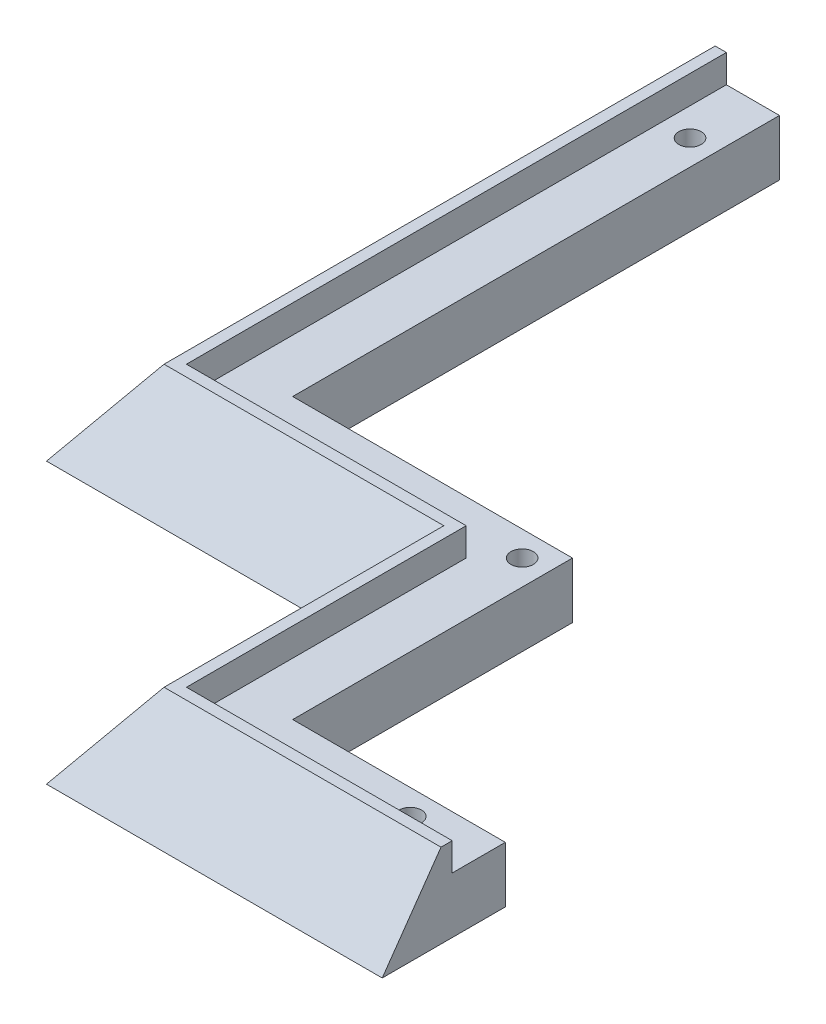
ISO-10303-21;
HEADER;
FILE_DESCRIPTION(('STEP AP214'),'2;1');
FILE_NAME('part.step','',(''),(''),'','','');
FILE_SCHEMA(('AUTOMOTIVE_DESIGN { 1 0 10303 214 1 1 1 1 }'));
ENDSEC;
DATA;
#1=APPLICATION_CONTEXT('core data for automotive mechanical design processes');
#2=APPLICATION_PROTOCOL_DEFINITION('international standard','automotive_design',2000,#1);
#3=PRODUCT_CONTEXT('',#1,'mechanical');
#4=PRODUCT('Part','Part','',(#3));
#5=PRODUCT_RELATED_PRODUCT_CATEGORY('part','',(#4));
#6=PRODUCT_DEFINITION_FORMATION('','',#4);
#7=PRODUCT_DEFINITION_CONTEXT('part definition',#1,'design');
#8=PRODUCT_DEFINITION('design','',#6,#7);
#9=PRODUCT_DEFINITION_SHAPE('','',#8);
#10=(LENGTH_UNIT() NAMED_UNIT(*) SI_UNIT(.MILLI.,.METRE.));
#11=(NAMED_UNIT(*) PLANE_ANGLE_UNIT() SI_UNIT($,.RADIAN.));
#12=(NAMED_UNIT(*) SI_UNIT($,.STERADIAN.) SOLID_ANGLE_UNIT());
#13=UNCERTAINTY_MEASURE_WITH_UNIT(LENGTH_MEASURE(1.E-05),#10,'distance_accuracy_value','');
#14=(GEOMETRIC_REPRESENTATION_CONTEXT(3) GLOBAL_UNCERTAINTY_ASSIGNED_CONTEXT((#13)) GLOBAL_UNIT_ASSIGNED_CONTEXT((#10,
#11,#12)) REPRESENTATION_CONTEXT('',''));
#15=CARTESIAN_POINT('',(0.,0.,0.));
#16=DIRECTION('',(0.,0.,1.));
#17=DIRECTION('',(1.,0.,0.));
#18=AXIS2_PLACEMENT_3D('',#15,#16,#17);
#19=CARTESIAN_POINT('',(68.6476510887299,15.,68.6476510887299));
#20=DIRECTION('',(-1.,0.,0.));
#21=DIRECTION('',(0.,0.,1.));
#22=AXIS2_PLACEMENT_3D('',#19,#20,#21);
#23=PLANE('',#22);
#24=DIRECTION('',(0.,0.,-1.));
#25=VECTOR('',#24,1.);
#26=CARTESIAN_POINT('',(68.6476510887299,10.,46.6476510887299));
#27=LINE('',#26,#25);
#28=CARTESIAN_POINT('',(68.6476510887299,10.,56.1403822311179));
#29=VERTEX_POINT('',#28);
#30=CARTESIAN_POINT('',(68.6476510887299,10.,46.6476510887299));
#31=VERTEX_POINT('',#30);
#32=EDGE_CURVE('E319',#29,#31,#27,.T.);
#33=ORIENTED_EDGE('',*,*,#32,.F.);
#34=DIRECTION('',(0.,1.,0.));
#35=VECTOR('',#34,1.);
#36=CARTESIAN_POINT('',(68.6476510887299,10.,56.1403822311179));
#37=LINE('',#36,#35);
#38=CARTESIAN_POINT('',(68.6476510887299,15.,56.1403822311179));
#39=VERTEX_POINT('',#38);
#40=EDGE_CURVE('E192',#29,#39,#37,.T.);
#41=ORIENTED_EDGE('',*,*,#40,.T.);
#42=DIRECTION('',(0.,0.,-1.));
#43=VECTOR('',#42,1.);
#44=CARTESIAN_POINT('',(68.6476510887299,15.,68.6476510887299));
#45=LINE('',#44,#43);
#46=CARTESIAN_POINT('',(68.6476510887299,15.,58.1445380155842));
#47=VERTEX_POINT('',#46);
#48=EDGE_CURVE('E193',#47,#39,#45,.T.);
#49=ORIENTED_EDGE('',*,*,#48,.F.);
#50=DIRECTION('',(0.,0.819152044288993,-0.573576436351045));
#51=VECTOR('',#50,1.);
#52=CARTESIAN_POINT('',(68.6476510887299,15.,58.1445380155842));
#53=LINE('',#52,#51);
#54=CARTESIAN_POINT('',(68.6476510887299,0.,68.6476510887299));
#55=VERTEX_POINT('',#54);
#56=EDGE_CURVE('E45',#47,#55,#53,.F.);
#57=ORIENTED_EDGE('',*,*,#56,.T.);
#58=DIRECTION('',(0.,0.,-1.));
#59=VECTOR('',#58,1.);
#60=CARTESIAN_POINT('',(68.6476510887299,0.,68.6476510887299));
#61=LINE('',#60,#59);
#62=CARTESIAN_POINT('',(68.6476510887299,0.,46.6476510887299));
#63=VERTEX_POINT('',#62);
#64=EDGE_CURVE('E211',#55,#63,#61,.T.);
#65=ORIENTED_EDGE('',*,*,#64,.T.);
#66=DIRECTION('',(0.,-1.,0.));
#67=VECTOR('',#66,1.);
#68=CARTESIAN_POINT('',(68.6476510887299,15.,46.6476510887299));
#69=LINE('',#68,#67);
#70=EDGE_CURVE('E235',#31,#63,#69,.T.);
#71=ORIENTED_EDGE('',*,*,#70,.F.);
#72=EDGE_LOOP('',(#33,#41,#49,#57,#65,#71));
#73=FACE_BOUND('',#72,.T.);
#74=ADVANCED_FACE('F35',(#73),#23,.F.);
#75=CARTESIAN_POINT('',(30.6476510887299,15.,46.6476510887299));
#76=DIRECTION('',(0.,0.,1.));
#77=DIRECTION('',(1.,0.,0.));
#78=AXIS2_PLACEMENT_3D('',#75,#76,#77);
#79=PLANE('',#78);
#80=DIRECTION('',(0.,-1.,0.));
#81=VECTOR('',#80,1.);
#82=CARTESIAN_POINT('',(30.6476510887299,15.,46.6476510887299));
#83=LINE('',#82,#81);
#84=CARTESIAN_POINT('',(30.6476510887299,10.,46.6476510887299));
#85=VERTEX_POINT('',#84);
#86=CARTESIAN_POINT('',(30.6476510887299,0.,46.6476510887299));
#87=VERTEX_POINT('',#86);
#88=EDGE_CURVE('E233',#85,#87,#83,.T.);
#89=ORIENTED_EDGE('',*,*,#88,.F.);
#90=DIRECTION('',(-1.,0.,0.));
#91=VECTOR('',#90,1.);
#92=CARTESIAN_POINT('',(30.6476510887299,10.,46.6476510887299));
#93=LINE('',#92,#91);
#94=EDGE_CURVE('E281',#31,#85,#93,.T.);
#95=ORIENTED_EDGE('',*,*,#94,.F.);
#96=ORIENTED_EDGE('',*,*,#70,.T.);
#97=DIRECTION('',(-1.,0.,0.));
#98=VECTOR('',#97,1.);
#99=CARTESIAN_POINT('',(30.6476510887299,0.,46.6476510887299));
#100=LINE('',#99,#98);
#101=EDGE_CURVE('E214',#63,#87,#100,.T.);
#102=ORIENTED_EDGE('',*,*,#101,.T.);
#103=EDGE_LOOP('',(#89,#95,#96,#102));
#104=FACE_BOUND('',#103,.T.);
#105=ADVANCED_FACE('F278',(#104),#79,.F.);
#106=CARTESIAN_POINT('',(30.6476510887299,15.,-3.3523489112701));
#107=DIRECTION('',(-1.,0.,0.));
#108=DIRECTION('',(0.,0.,1.));
#109=AXIS2_PLACEMENT_3D('',#106,#107,#108);
#110=PLANE('',#109);
#111=DIRECTION('',(0.,-1.,0.));
#112=VECTOR('',#111,1.);
#113=CARTESIAN_POINT('',(30.6476510887299,15.,-3.3523489112701));
#114=LINE('',#113,#112);
#115=CARTESIAN_POINT('',(30.6476510887299,10.,-3.3523489112701));
#116=VERTEX_POINT('',#115);
#117=CARTESIAN_POINT('',(30.6476510887299,0.,-3.3523489112701));
#118=VERTEX_POINT('',#117);
#119=EDGE_CURVE('E231',#116,#118,#114,.T.);
#120=ORIENTED_EDGE('',*,*,#119,.F.);
#121=DIRECTION('',(0.,0.,-1.));
#122=VECTOR('',#121,1.);
#123=CARTESIAN_POINT('',(30.6476510887299,10.,-3.3523489112701));
#124=LINE('',#123,#122);
#125=EDGE_CURVE('E316',#85,#116,#124,.T.);
#126=ORIENTED_EDGE('',*,*,#125,.F.);
#127=ORIENTED_EDGE('',*,*,#88,.T.);
#128=DIRECTION('',(0.,0.,-1.));
#129=VECTOR('',#128,1.);
#130=CARTESIAN_POINT('',(30.6476510887299,0.,-3.3523489112701));
#131=LINE('',#130,#129);
#132=EDGE_CURVE('E217',#87,#118,#131,.T.);
#133=ORIENTED_EDGE('',*,*,#132,.T.);
#134=EDGE_LOOP('',(#120,#126,#127,#133));
#135=FACE_BOUND('',#134,.T.);
#136=ADVANCED_FACE('F273',(#135),#110,.F.);
#137=CARTESIAN_POINT('',(-19.3523489112701,15.,-3.3523489112701));
#138=DIRECTION('',(0.,0.,1.));
#139=DIRECTION('',(1.,0.,0.));
#140=AXIS2_PLACEMENT_3D('',#137,#138,#139);
#141=PLANE('',#140);
#142=DIRECTION('',(0.,-1.,0.));
#143=VECTOR('',#142,1.);
#144=CARTESIAN_POINT('',(-19.3523489112701,15.,-3.3523489112701));
#145=LINE('',#144,#143);
#146=CARTESIAN_POINT('',(-19.3523489112701,10.,-3.3523489112701));
#147=VERTEX_POINT('',#146);
#148=CARTESIAN_POINT('',(-19.3523489112701,0.,-3.3523489112701));
#149=VERTEX_POINT('',#148);
#150=EDGE_CURVE('E229',#147,#149,#145,.T.);
#151=ORIENTED_EDGE('',*,*,#150,.F.);
#152=DIRECTION('',(-1.,0.,0.));
#153=VECTOR('',#152,1.);
#154=CARTESIAN_POINT('',(-19.3523489112701,10.,-3.3523489112701));
#155=LINE('',#154,#153);
#156=EDGE_CURVE('E169',#116,#147,#155,.T.);
#157=ORIENTED_EDGE('',*,*,#156,.F.);
#158=ORIENTED_EDGE('',*,*,#119,.T.);
#159=DIRECTION('',(-1.,0.,0.));
#160=VECTOR('',#159,1.);
#161=CARTESIAN_POINT('',(-19.3523489112701,0.,-3.3523489112701));
#162=LINE('',#161,#160);
#163=EDGE_CURVE('E220',#118,#149,#162,.T.);
#164=ORIENTED_EDGE('',*,*,#163,.T.);
#165=EDGE_LOOP('',(#151,#157,#158,#164));
#166=FACE_BOUND('',#165,.T.);
#167=ADVANCED_FACE('F268',(#166),#141,.F.);
#168=CARTESIAN_POINT('',(-19.3523489112701,15.,-90.3523489112701));
#169=DIRECTION('',(-1.,0.,0.));
#170=DIRECTION('',(0.,0.,1.));
#171=AXIS2_PLACEMENT_3D('',#168,#169,#170);
#172=PLANE('',#171);
#173=DIRECTION('',(0.,-1.,0.));
#174=VECTOR('',#173,1.);
#175=CARTESIAN_POINT('',(-19.3523489112701,15.,-90.3523489112701));
#176=LINE('',#175,#174);
#177=CARTESIAN_POINT('',(-19.3523489112701,10.,-90.3523489112701));
#178=VERTEX_POINT('',#177);
#179=CARTESIAN_POINT('',(-19.3523489112701,0.,-90.3523489112701));
#180=VERTEX_POINT('',#179);
#181=EDGE_CURVE('E198',#178,#180,#176,.T.);
#182=ORIENTED_EDGE('',*,*,#181,.F.);
#183=DIRECTION('',(0.,0.,-1.));
#184=VECTOR('',#183,1.);
#185=CARTESIAN_POINT('',(-19.3523489112701,10.,-90.3523489112701));
#186=LINE('',#185,#184);
#187=EDGE_CURVE('E158',#147,#178,#186,.T.);
#188=ORIENTED_EDGE('',*,*,#187,.F.);
#189=ORIENTED_EDGE('',*,*,#150,.T.);
#190=DIRECTION('',(0.,0.,-1.));
#191=VECTOR('',#190,1.);
#192=CARTESIAN_POINT('',(-19.3523489112701,0.,-90.3523489112701));
#193=LINE('',#192,#191);
#194=EDGE_CURVE('E223',#149,#180,#193,.T.);
#195=ORIENTED_EDGE('',*,*,#194,.T.);
#196=EDGE_LOOP('',(#182,#188,#189,#195));
#197=FACE_BOUND('',#196,.T.);
#198=ADVANCED_FACE('F263',(#197),#172,.F.);
#199=CARTESIAN_POINT('',(-41.3523489112701,15.,-90.3523489112701));
#200=DIRECTION('',(0.,0.,1.));
#201=DIRECTION('',(1.,0.,0.));
#202=AXIS2_PLACEMENT_3D('',#199,#200,#201);
#203=PLANE('',#202);
#204=DIRECTION('',(-1.,0.,0.));
#205=VECTOR('',#204,1.);
#206=CARTESIAN_POINT('',(-41.3523489112701,15.,-90.3523489112701));
#207=LINE('',#206,#205);
#208=CARTESIAN_POINT('',(-28.8492358381245,15.,-90.3523489112701));
#209=VERTEX_POINT('',#208);
#210=CARTESIAN_POINT('',(-30.8492358381244,15.,-90.3523489112701));
#211=VERTEX_POINT('',#210);
#212=EDGE_CURVE('E165',#209,#211,#207,.T.);
#213=ORIENTED_EDGE('',*,*,#212,.F.);
#214=DIRECTION('',(0.,1.,0.));
#215=VECTOR('',#214,1.);
#216=CARTESIAN_POINT('',(-28.8492358381245,10.,-90.3523489112701));
#217=LINE('',#216,#215);
#218=CARTESIAN_POINT('',(-28.8492358381245,10.,-90.3523489112701));
#219=VERTEX_POINT('',#218);
#220=EDGE_CURVE('E53',#219,#209,#217,.T.);
#221=ORIENTED_EDGE('',*,*,#220,.F.);
#222=DIRECTION('',(-1.,0.,0.));
#223=VECTOR('',#222,1.);
#224=CARTESIAN_POINT('',(-28.8492358381245,10.,-90.3523489112701));
#225=LINE('',#224,#223);
#226=EDGE_CURVE('E153',#178,#219,#225,.T.);
#227=ORIENTED_EDGE('',*,*,#226,.F.);
#228=ORIENTED_EDGE('',*,*,#181,.T.);
#229=DIRECTION('',(-1.,0.,0.));
#230=VECTOR('',#229,1.);
#231=CARTESIAN_POINT('',(-41.3523489112701,0.,-90.3523489112701));
#232=LINE('',#231,#230);
#233=CARTESIAN_POINT('',(-41.3523489112701,0.,-90.3523489112701));
#234=VERTEX_POINT('',#233);
#235=EDGE_CURVE('E196',#180,#234,#232,.T.);
#236=ORIENTED_EDGE('',*,*,#235,.T.);
#237=DIRECTION('',(-0.573576436351045,-0.819152044288993,0.));
#238=VECTOR('',#237,1.);
#239=CARTESIAN_POINT('',(-30.8492358381244,15.,-90.3523489112701));
#240=LINE('',#239,#238);
#241=EDGE_CURVE('E11',#234,#211,#240,.F.);
#242=ORIENTED_EDGE('',*,*,#241,.T.);
#243=EDGE_LOOP('',(#213,#221,#227,#228,#236,#242));
#244=FACE_BOUND('',#243,.T.);
#245=ADVANCED_FACE('F164',(#244),#203,.F.);
#246=CARTESIAN_POINT('',(0.,15.,0.));
#247=DIRECTION('',(0.,-1.,0.));
#248=DIRECTION('',(0.,0.,-1.));
#249=AXIS2_PLACEMENT_3D('',#246,#247,#248);
#250=PLANE('',#249);
#251=ORIENTED_EDGE('',*,*,#48,.T.);
#252=DIRECTION('',(1.,0.,0.));
#253=VECTOR('',#252,1.);
#254=CARTESIAN_POINT('',(68.6476510887299,15.,56.1403822311179));
#255=LINE('',#254,#253);
#256=CARTESIAN_POINT('',(21.1507641618755,15.,56.1403822311179));
#257=VERTEX_POINT('',#256);
#258=EDGE_CURVE('E161',#257,#39,#255,.T.);
#259=ORIENTED_EDGE('',*,*,#258,.F.);
#260=DIRECTION('',(0.,0.,1.));
#261=VECTOR('',#260,1.);
#262=CARTESIAN_POINT('',(21.1507641618755,15.,56.1403822311179));
#263=LINE('',#262,#261);
#264=CARTESIAN_POINT('',(21.1507641618755,15.,6.14453801558427));
#265=VERTEX_POINT('',#264);
#266=EDGE_CURVE('E294',#265,#257,#263,.T.);
#267=ORIENTED_EDGE('',*,*,#266,.F.);
#268=DIRECTION('',(1.,0.,0.));
#269=VECTOR('',#268,1.);
#270=CARTESIAN_POINT('',(21.1507641618755,15.,6.14453801558427));
#271=LINE('',#270,#269);
#272=CARTESIAN_POINT('',(-28.8492358381245,15.,6.14453801558427));
#273=VERTEX_POINT('',#272);
#274=EDGE_CURVE('E297',#273,#265,#271,.T.);
#275=ORIENTED_EDGE('',*,*,#274,.F.);
#276=DIRECTION('',(0.,0.,1.));
#277=VECTOR('',#276,1.);
#278=CARTESIAN_POINT('',(-28.8492358381245,15.,6.14453801558427));
#279=LINE('',#278,#277);
#280=EDGE_CURVE('E311',#209,#273,#279,.T.);
#281=ORIENTED_EDGE('',*,*,#280,.F.);
#282=ORIENTED_EDGE('',*,*,#212,.T.);
#283=DIRECTION('',(0.,0.,1.));
#284=VECTOR('',#283,1.);
#285=CARTESIAN_POINT('',(-30.8492358381244,15.,0.));
#286=LINE('',#285,#284);
#287=CARTESIAN_POINT('',(-30.8492358381244,15.,8.14453801558422));
#288=VERTEX_POINT('',#287);
#289=EDGE_CURVE('E237',#211,#288,#286,.T.);
#290=ORIENTED_EDGE('',*,*,#289,.T.);
#291=DIRECTION('',(1.,0.,0.));
#292=VECTOR('',#291,1.);
#293=CARTESIAN_POINT('',(0.,15.,8.14453801558422));
#294=LINE('',#293,#292);
#295=CARTESIAN_POINT('',(19.1507641618756,15.,8.14453801558422));
#296=VERTEX_POINT('',#295);
#297=EDGE_CURVE('E239',#288,#296,#294,.T.);
#298=ORIENTED_EDGE('',*,*,#297,.T.);
#299=DIRECTION('',(0.,0.,1.));
#300=VECTOR('',#299,1.);
#301=CARTESIAN_POINT('',(19.1507641618756,15.,0.));
#302=LINE('',#301,#300);
#303=CARTESIAN_POINT('',(19.1507641618756,15.,58.1445380155842));
#304=VERTEX_POINT('',#303);
#305=EDGE_CURVE('E61',#296,#304,#302,.T.);
#306=ORIENTED_EDGE('',*,*,#305,.T.);
#307=DIRECTION('',(1.,0.,0.));
#308=VECTOR('',#307,1.);
#309=CARTESIAN_POINT('',(0.,15.,58.1445380155842));
#310=LINE('',#309,#308);
#311=EDGE_CURVE('E242',#304,#47,#310,.T.);
#312=ORIENTED_EDGE('',*,*,#311,.T.);
#313=EDGE_LOOP('',(#251,#259,#267,#275,#281,#282,#290,#298,#306,#312));
#314=FACE_BOUND('',#313,.T.);
#315=ADVANCED_FACE('F289',(#314),#250,.F.);
#316=CARTESIAN_POINT('',(0.,0.,0.));
#317=DIRECTION('',(0.,-1.,0.));
#318=DIRECTION('',(0.,0.,-1.));
#319=AXIS2_PLACEMENT_3D('',#316,#317,#318);
#320=PLANE('',#319);
#321=CARTESIAN_POINT('',(38.6476510887299,0.,63.6476510887299));
#322=DIRECTION('',(0.,-1.,0.));
#323=DIRECTION('',(0.,0.,-1.));
#324=AXIS2_PLACEMENT_3D('',#321,#322,#323);
#325=CIRCLE('',#324,2.);
#326=CARTESIAN_POINT('',(38.6476510887299,0.,61.6476510887299));
#327=VERTEX_POINT('',#326);
#328=EDGE_CURVE('E177',#327,#327,#325,.T.);
#329=ORIENTED_EDGE('',*,*,#328,.F.);
#330=EDGE_LOOP('',(#329));
#331=FACE_BOUND('',#330,.T.);
#332=CARTESIAN_POINT('',(13.6476510887299,0.,38.6476510887299));
#333=DIRECTION('',(0.,-1.,0.));
#334=DIRECTION('',(0.,0.,-1.));
#335=AXIS2_PLACEMENT_3D('',#332,#333,#334);
#336=CIRCLE('',#335,2.);
#337=CARTESIAN_POINT('',(13.6476510887299,0.,36.6476510887299));
#338=VERTEX_POINT('',#337);
#339=EDGE_CURVE('E183',#338,#338,#336,.T.);
#340=ORIENTED_EDGE('',*,*,#339,.F.);
#341=EDGE_LOOP('',(#340));
#342=FACE_BOUND('',#341,.T.);
#343=CARTESIAN_POINT('',(-11.3523489112701,0.,13.6476510887299));
#344=DIRECTION('',(0.,-1.,0.));
#345=DIRECTION('',(0.,0.,-1.));
#346=AXIS2_PLACEMENT_3D('',#343,#344,#345);
#347=CIRCLE('',#346,2.);
#348=CARTESIAN_POINT('',(-11.3523489112701,0.,11.6476510887299));
#349=VERTEX_POINT('',#348);
#350=EDGE_CURVE('E189',#349,#349,#347,.T.);
#351=ORIENTED_EDGE('',*,*,#350,.F.);
#352=EDGE_LOOP('',(#351));
#353=FACE_BOUND('',#352,.T.);
#354=DIRECTION('',(0.,0.,1.));
#355=VECTOR('',#354,1.);
#356=CARTESIAN_POINT('',(-41.3523489112701,0.,18.6476510887299));
#357=LINE('',#356,#355);
#358=CARTESIAN_POINT('',(-41.3523489112701,0.,18.6476510887299));
#359=VERTEX_POINT('',#358);
#360=EDGE_CURVE('E199',#234,#359,#357,.T.);
#361=ORIENTED_EDGE('',*,*,#360,.F.);
#362=ORIENTED_EDGE('',*,*,#235,.F.);
#363=ORIENTED_EDGE('',*,*,#194,.F.);
#364=ORIENTED_EDGE('',*,*,#163,.F.);
#365=ORIENTED_EDGE('',*,*,#132,.F.);
#366=ORIENTED_EDGE('',*,*,#101,.F.);
#367=ORIENTED_EDGE('',*,*,#64,.F.);
#368=DIRECTION('',(1.,0.,0.));
#369=VECTOR('',#368,1.);
#370=CARTESIAN_POINT('',(68.6476510887299,0.,68.6476510887299));
#371=LINE('',#370,#369);
#372=CARTESIAN_POINT('',(8.64765108872991,0.,68.6476510887299));
#373=VERTEX_POINT('',#372);
#374=EDGE_CURVE('E208',#373,#55,#371,.T.);
#375=ORIENTED_EDGE('',*,*,#374,.F.);
#376=DIRECTION('',(0.,0.,1.));
#377=VECTOR('',#376,1.);
#378=CARTESIAN_POINT('',(8.6476510887299,0.,18.6476510887299));
#379=LINE('',#378,#377);
#380=CARTESIAN_POINT('',(8.6476510887299,0.,18.6476510887299));
#381=VERTEX_POINT('',#380);
#382=EDGE_CURVE('E205',#381,#373,#379,.T.);
#383=ORIENTED_EDGE('',*,*,#382,.F.);
#384=DIRECTION('',(1.,0.,0.));
#385=VECTOR('',#384,1.);
#386=CARTESIAN_POINT('',(-41.3523489112701,0.,18.6476510887299));
#387=LINE('',#386,#385);
#388=EDGE_CURVE('E202',#359,#381,#387,.T.);
#389=ORIENTED_EDGE('',*,*,#388,.F.);
#390=EDGE_LOOP('',(#361,#362,#363,#364,#365,#366,#367,#375,#383,#389));
#391=FACE_BOUND('',#390,.T.);
#392=ADVANCED_FACE('F260',(#331,#342,#353,#391),#320,.T.);
#393=CARTESIAN_POINT('',(-30.8492358381244,15.,0.));
#394=DIRECTION('',(0.819152044288993,-0.573576436351045,0.));
#395=DIRECTION('',(0.,0.,1.));
#396=AXIS2_PLACEMENT_3D('',#393,#394,#395);
#397=PLANE('',#396);
#398=ORIENTED_EDGE('',*,*,#241,.F.);
#399=ORIENTED_EDGE('',*,*,#360,.T.);
#400=DIRECTION('',(0.497542812164522,0.710564775461631,-0.497542812164522));
#401=VECTOR('',#400,1.);
#402=CARTESIAN_POINT('',(-28.8330648191018,17.8793906220684,6.12836699656159));
#403=LINE('',#402,#401);
#404=EDGE_CURVE('E40',#288,#359,#403,.F.);
#405=ORIENTED_EDGE('',*,*,#404,.F.);
#406=ORIENTED_EDGE('',*,*,#289,.F.);
#407=EDGE_LOOP('',(#398,#399,#405,#406));
#408=FACE_BOUND('',#407,.T.);
#409=ADVANCED_FACE('F38',(#408),#397,.F.);
#410=CARTESIAN_POINT('',(0.,15.,8.14453801558422));
#411=DIRECTION('',(0.,-0.573576436351045,-0.819152044288993));
#412=DIRECTION('',(1.,0.,0.));
#413=AXIS2_PLACEMENT_3D('',#410,#411,#412);
#414=PLANE('',#413);
#415=ORIENTED_EDGE('',*,*,#404,.T.);
#416=ORIENTED_EDGE('',*,*,#388,.T.);
#417=DIRECTION('',(0.497542812164522,0.710564775461631,-0.497542812164522));
#418=VECTOR('',#417,1.);
#419=CARTESIAN_POINT('',(21.1669351808982,17.8793906220684,6.12836699656159));
#420=LINE('',#419,#418);
#421=EDGE_CURVE('E246',#296,#381,#420,.F.);
#422=ORIENTED_EDGE('',*,*,#421,.F.);
#423=ORIENTED_EDGE('',*,*,#297,.F.);
#424=EDGE_LOOP('',(#415,#416,#422,#423));
#425=FACE_BOUND('',#424,.T.);
#426=ADVANCED_FACE('F254',(#425),#414,.F.);
#427=CARTESIAN_POINT('',(19.1507641618756,15.,0.));
#428=DIRECTION('',(0.819152044288993,-0.573576436351045,0.));
#429=DIRECTION('',(0.,0.,1.));
#430=AXIS2_PLACEMENT_3D('',#427,#428,#429);
#431=PLANE('',#430);
#432=ORIENTED_EDGE('',*,*,#421,.T.);
#433=ORIENTED_EDGE('',*,*,#382,.T.);
#434=DIRECTION('',(0.497542812164522,0.710564775461631,-0.497542812164522));
#435=VECTOR('',#434,1.);
#436=CARTESIAN_POINT('',(33.5443776777273,35.55621045248,43.7509244997325));
#437=LINE('',#436,#435);
#438=EDGE_CURVE('E176',#304,#373,#437,.F.);
#439=ORIENTED_EDGE('',*,*,#438,.F.);
#440=ORIENTED_EDGE('',*,*,#305,.F.);
#441=EDGE_LOOP('',(#432,#433,#439,#440));
#442=FACE_BOUND('',#441,.T.);
#443=ADVANCED_FACE('F387',(#442),#431,.F.);
#444=CARTESIAN_POINT('',(0.,15.,58.1445380155842));
#445=DIRECTION('',(0.,-0.573576436351045,-0.819152044288993));
#446=DIRECTION('',(1.,0.,0.));
#447=AXIS2_PLACEMENT_3D('',#444,#445,#446);
#448=PLANE('',#447);
#449=ORIENTED_EDGE('',*,*,#438,.T.);
#450=ORIENTED_EDGE('',*,*,#374,.T.);
#451=ORIENTED_EDGE('',*,*,#56,.F.);
#452=ORIENTED_EDGE('',*,*,#311,.F.);
#453=EDGE_LOOP('',(#449,#450,#451,#452));
#454=FACE_BOUND('',#453,.T.);
#455=ADVANCED_FACE('F288',(#454),#448,.F.);
#456=CARTESIAN_POINT('',(-11.3523489112701,4.,13.6476510887299));
#457=DIRECTION('',(0.,-1.,0.));
#458=DIRECTION('',(0.,0.,-1.));
#459=AXIS2_PLACEMENT_3D('',#456,#457,#458);
#460=CYLINDRICAL_SURFACE('',#459,2.);
#461=CARTESIAN_POINT('',(-11.3523489112701,4.,13.6476510887299));
#462=DIRECTION('',(0.,-1.,0.));
#463=DIRECTION('',(0.,0.,-1.));
#464=AXIS2_PLACEMENT_3D('',#461,#462,#463);
#465=CIRCLE('',#464,2.);
#466=CARTESIAN_POINT('',(-11.3523489112701,4.,11.6476510887299));
#467=VERTEX_POINT('',#466);
#468=EDGE_CURVE('E186',#467,#467,#465,.T.);
#469=ORIENTED_EDGE('',*,*,#468,.F.);
#470=EDGE_LOOP('',(#469));
#471=FACE_BOUND('',#470,.T.);
#472=ORIENTED_EDGE('',*,*,#350,.T.);
#473=EDGE_LOOP('',(#472));
#474=FACE_BOUND('',#473,.T.);
#475=ADVANCED_FACE('F386',(#471,#474),#460,.F.);
#476=CARTESIAN_POINT('',(-11.3523489112701,4.,13.6476510887299));
#477=DIRECTION('',(0.,-1.,0.));
#478=DIRECTION('',(0.,0.,-1.));
#479=AXIS2_PLACEMENT_3D('',#476,#477,#478);
#480=PLANE('',#479);
#481=ORIENTED_EDGE('',*,*,#468,.T.);
#482=EDGE_LOOP('',(#481));
#483=FACE_BOUND('',#482,.T.);
#484=ADVANCED_FACE('F542',(#483),#480,.T.);
#485=CARTESIAN_POINT('',(13.6476510887299,4.,38.6476510887299));
#486=DIRECTION('',(0.,-1.,0.));
#487=DIRECTION('',(0.,0.,-1.));
#488=AXIS2_PLACEMENT_3D('',#485,#486,#487);
#489=CYLINDRICAL_SURFACE('',#488,2.);
#490=CARTESIAN_POINT('',(13.6476510887299,4.,38.6476510887299));
#491=DIRECTION('',(0.,-1.,0.));
#492=DIRECTION('',(0.,0.,-1.));
#493=AXIS2_PLACEMENT_3D('',#490,#491,#492);
#494=CIRCLE('',#493,2.);
#495=CARTESIAN_POINT('',(13.6476510887299,4.,36.6476510887299));
#496=VERTEX_POINT('',#495);
#497=EDGE_CURVE('E180',#496,#496,#494,.T.);
#498=ORIENTED_EDGE('',*,*,#497,.F.);
#499=EDGE_LOOP('',(#498));
#500=FACE_BOUND('',#499,.T.);
#501=ORIENTED_EDGE('',*,*,#339,.T.);
#502=EDGE_LOOP('',(#501));
#503=FACE_BOUND('',#502,.T.);
#504=ADVANCED_FACE('F538',(#500,#503),#489,.F.);
#505=CARTESIAN_POINT('',(13.6476510887299,4.,38.6476510887299));
#506=DIRECTION('',(0.,-1.,0.));
#507=DIRECTION('',(0.,0.,-1.));
#508=AXIS2_PLACEMENT_3D('',#505,#506,#507);
#509=PLANE('',#508);
#510=ORIENTED_EDGE('',*,*,#497,.T.);
#511=EDGE_LOOP('',(#510));
#512=FACE_BOUND('',#511,.T.);
#513=ADVANCED_FACE('F534',(#512),#509,.T.);
#514=CARTESIAN_POINT('',(38.6476510887299,4.,63.6476510887299));
#515=DIRECTION('',(0.,-1.,0.));
#516=DIRECTION('',(0.,0.,-1.));
#517=AXIS2_PLACEMENT_3D('',#514,#515,#516);
#518=CYLINDRICAL_SURFACE('',#517,2.);
#519=CARTESIAN_POINT('',(38.6476510887299,4.,63.6476510887299));
#520=DIRECTION('',(0.,-1.,0.));
#521=DIRECTION('',(0.,0.,-1.));
#522=AXIS2_PLACEMENT_3D('',#519,#520,#521);
#523=CIRCLE('',#522,2.);
#524=CARTESIAN_POINT('',(38.6476510887299,4.,61.6476510887299));
#525=VERTEX_POINT('',#524);
#526=EDGE_CURVE('E173',#525,#525,#523,.T.);
#527=ORIENTED_EDGE('',*,*,#526,.F.);
#528=EDGE_LOOP('',(#527));
#529=FACE_BOUND('',#528,.T.);
#530=ORIENTED_EDGE('',*,*,#328,.T.);
#531=EDGE_LOOP('',(#530));
#532=FACE_BOUND('',#531,.T.);
#533=ADVANCED_FACE('F530',(#529,#532),#518,.F.);
#534=CARTESIAN_POINT('',(38.6476510887299,4.,63.6476510887299));
#535=DIRECTION('',(0.,-1.,0.));
#536=DIRECTION('',(0.,0.,-1.));
#537=AXIS2_PLACEMENT_3D('',#534,#535,#536);
#538=PLANE('',#537);
#539=ORIENTED_EDGE('',*,*,#526,.T.);
#540=EDGE_LOOP('',(#539));
#541=FACE_BOUND('',#540,.T.);
#542=ADVANCED_FACE('F448',(#541),#538,.T.);
#543=CARTESIAN_POINT('',(68.6476510887299,10.,56.1403822311179));
#544=DIRECTION('',(0.,0.,1.));
#545=DIRECTION('',(1.,0.,0.));
#546=AXIS2_PLACEMENT_3D('',#543,#544,#545);
#547=PLANE('',#546);
#548=ORIENTED_EDGE('',*,*,#258,.T.);
#549=ORIENTED_EDGE('',*,*,#40,.F.);
#550=DIRECTION('',(1.,0.,0.));
#551=VECTOR('',#550,1.);
#552=CARTESIAN_POINT('',(68.6476510887299,10.,56.1403822311179));
#553=LINE('',#552,#551);
#554=CARTESIAN_POINT('',(21.1507641618755,10.,56.1403822311179));
#555=VERTEX_POINT('',#554);
#556=EDGE_CURVE('E321',#555,#29,#553,.T.);
#557=ORIENTED_EDGE('',*,*,#556,.F.);
#558=DIRECTION('',(0.,1.,0.));
#559=VECTOR('',#558,1.);
#560=CARTESIAN_POINT('',(21.1507641618755,10.,56.1403822311179));
#561=LINE('',#560,#559);
#562=EDGE_CURVE('E302',#555,#257,#561,.T.);
#563=ORIENTED_EDGE('',*,*,#562,.T.);
#564=EDGE_LOOP('',(#548,#549,#557,#563));
#565=FACE_BOUND('',#564,.T.);
#566=ADVANCED_FACE('F443',(#565),#547,.F.);
#567=CARTESIAN_POINT('',(21.1507641618755,10.,56.1403822311179));
#568=DIRECTION('',(-1.,0.,0.));
#569=DIRECTION('',(0.,0.,1.));
#570=AXIS2_PLACEMENT_3D('',#567,#568,#569);
#571=PLANE('',#570);
#572=ORIENTED_EDGE('',*,*,#266,.T.);
#573=ORIENTED_EDGE('',*,*,#562,.F.);
#574=DIRECTION('',(0.,0.,1.));
#575=VECTOR('',#574,1.);
#576=CARTESIAN_POINT('',(21.1507641618755,10.,56.1403822311179));
#577=LINE('',#576,#575);
#578=CARTESIAN_POINT('',(21.1507641618755,10.,6.14453801558427));
#579=VERTEX_POINT('',#578);
#580=EDGE_CURVE('E308',#579,#555,#577,.T.);
#581=ORIENTED_EDGE('',*,*,#580,.F.);
#582=DIRECTION('',(0.,1.,0.));
#583=VECTOR('',#582,1.);
#584=CARTESIAN_POINT('',(21.1507641618755,10.,6.14453801558427));
#585=LINE('',#584,#583);
#586=EDGE_CURVE('E167',#579,#265,#585,.T.);
#587=ORIENTED_EDGE('',*,*,#586,.T.);
#588=EDGE_LOOP('',(#572,#573,#581,#587));
#589=FACE_BOUND('',#588,.T.);
#590=ADVANCED_FACE('F306',(#589),#571,.F.);
#591=CARTESIAN_POINT('',(21.1507641618755,10.,6.14453801558427));
#592=DIRECTION('',(0.,0.,1.));
#593=DIRECTION('',(1.,0.,0.));
#594=AXIS2_PLACEMENT_3D('',#591,#592,#593);
#595=PLANE('',#594);
#596=ORIENTED_EDGE('',*,*,#274,.T.);
#597=ORIENTED_EDGE('',*,*,#586,.F.);
#598=DIRECTION('',(1.,0.,0.));
#599=VECTOR('',#598,1.);
#600=CARTESIAN_POINT('',(21.1507641618755,10.,6.14453801558427));
#601=LINE('',#600,#599);
#602=CARTESIAN_POINT('',(-28.8492358381245,10.,6.14453801558427));
#603=VERTEX_POINT('',#602);
#604=EDGE_CURVE('E152',#603,#579,#601,.T.);
#605=ORIENTED_EDGE('',*,*,#604,.F.);
#606=DIRECTION('',(0.,1.,0.));
#607=VECTOR('',#606,1.);
#608=CARTESIAN_POINT('',(-28.8492358381245,10.,6.14453801558427));
#609=LINE('',#608,#607);
#610=EDGE_CURVE('E148',#603,#273,#609,.T.);
#611=ORIENTED_EDGE('',*,*,#610,.T.);
#612=EDGE_LOOP('',(#596,#597,#605,#611));
#613=FACE_BOUND('',#612,.T.);
#614=ADVANCED_FACE('F310',(#613),#595,.F.);
#615=CARTESIAN_POINT('',(-28.8492358381245,10.,6.14453801558427));
#616=DIRECTION('',(-1.,0.,0.));
#617=DIRECTION('',(0.,0.,1.));
#618=AXIS2_PLACEMENT_3D('',#615,#616,#617);
#619=PLANE('',#618);
#620=ORIENTED_EDGE('',*,*,#280,.T.);
#621=ORIENTED_EDGE('',*,*,#610,.F.);
#622=DIRECTION('',(0.,0.,1.));
#623=VECTOR('',#622,1.);
#624=CARTESIAN_POINT('',(-28.8492358381245,10.,6.14453801558427));
#625=LINE('',#624,#623);
#626=EDGE_CURVE('E145',#219,#603,#625,.T.);
#627=ORIENTED_EDGE('',*,*,#626,.F.);
#628=ORIENTED_EDGE('',*,*,#220,.T.);
#629=EDGE_LOOP('',(#620,#621,#627,#628));
#630=FACE_BOUND('',#629,.T.);
#631=ADVANCED_FACE('F147',(#630),#619,.F.);
#632=CARTESIAN_POINT('',(0.,10.,0.));
#633=DIRECTION('',(0.,-1.,0.));
#634=DIRECTION('',(0.,0.,-1.));
#635=AXIS2_PLACEMENT_3D('',#632,#633,#634);
#636=PLANE('',#635);
#637=CARTESIAN_POINT('',(-23.8492358381245,10.,-78.8554619844157));
#638=DIRECTION('',(0.,1.,0.));
#639=DIRECTION('',(0.,0.,1.));
#640=AXIS2_PLACEMENT_3D('',#637,#638,#639);
#641=CIRCLE('',#640,2.);
#642=CARTESIAN_POINT('',(-23.8492358381245,10.,-76.8554619844157));
#643=VERTEX_POINT('',#642);
#644=EDGE_CURVE('E338',#643,#643,#641,.T.);
#645=ORIENTED_EDGE('',*,*,#644,.F.);
#646=EDGE_LOOP('',(#645));
#647=FACE_BOUND('',#646,.T.);
#648=CARTESIAN_POINT('',(26.1507641618755,10.,1.14453801558427));
#649=DIRECTION('',(0.,1.,0.));
#650=DIRECTION('',(0.,0.,1.));
#651=AXIS2_PLACEMENT_3D('',#648,#649,#650);
#652=CIRCLE('',#651,2.);
#653=CARTESIAN_POINT('',(26.1507641618755,10.,3.14453801558427));
#654=VERTEX_POINT('',#653);
#655=EDGE_CURVE('E332',#654,#654,#652,.T.);
#656=ORIENTED_EDGE('',*,*,#655,.F.);
#657=EDGE_LOOP('',(#656));
#658=FACE_BOUND('',#657,.T.);
#659=CARTESIAN_POINT('',(56.1507641618755,10.,51.1403822311179));
#660=DIRECTION('',(0.,1.,0.));
#661=DIRECTION('',(0.,0.,1.));
#662=AXIS2_PLACEMENT_3D('',#659,#660,#661);
#663=CIRCLE('',#662,2.);
#664=CARTESIAN_POINT('',(56.1507641618755,10.,53.1403822311179));
#665=VERTEX_POINT('',#664);
#666=EDGE_CURVE('E326',#665,#665,#663,.T.);
#667=ORIENTED_EDGE('',*,*,#666,.F.);
#668=EDGE_LOOP('',(#667));
#669=FACE_BOUND('',#668,.T.);
#670=ORIENTED_EDGE('',*,*,#226,.T.);
#671=ORIENTED_EDGE('',*,*,#626,.T.);
#672=ORIENTED_EDGE('',*,*,#604,.T.);
#673=ORIENTED_EDGE('',*,*,#580,.T.);
#674=ORIENTED_EDGE('',*,*,#556,.T.);
#675=ORIENTED_EDGE('',*,*,#32,.T.);
#676=ORIENTED_EDGE('',*,*,#94,.T.);
#677=ORIENTED_EDGE('',*,*,#125,.T.);
#678=ORIENTED_EDGE('',*,*,#156,.T.);
#679=ORIENTED_EDGE('',*,*,#187,.T.);
#680=EDGE_LOOP('',(#670,#671,#672,#673,#674,#675,#676,#677,#678,#679));
#681=FACE_BOUND('',#680,.T.);
#682=ADVANCED_FACE('F156',(#647,#658,#669,#681),#636,.F.);
#683=CARTESIAN_POINT('',(56.1507641618755,5.,51.1403822311179));
#684=DIRECTION('',(0.,1.,0.));
#685=DIRECTION('',(0.,0.,1.));
#686=AXIS2_PLACEMENT_3D('',#683,#684,#685);
#687=CYLINDRICAL_SURFACE('',#686,2.);
#688=CARTESIAN_POINT('',(56.1507641618755,5.,51.1403822311179));
#689=DIRECTION('',(0.,1.,0.));
#690=DIRECTION('',(0.,0.,1.));
#691=AXIS2_PLACEMENT_3D('',#688,#689,#690);
#692=CIRCLE('',#691,2.);
#693=CARTESIAN_POINT('',(56.1507641618755,5.,53.1403822311179));
#694=VERTEX_POINT('',#693);
#695=EDGE_CURVE('E329',#694,#694,#692,.T.);
#696=ORIENTED_EDGE('',*,*,#695,.F.);
#697=EDGE_LOOP('',(#696));
#698=FACE_BOUND('',#697,.T.);
#699=ORIENTED_EDGE('',*,*,#666,.T.);
#700=EDGE_LOOP('',(#699));
#701=FACE_BOUND('',#700,.T.);
#702=ADVANCED_FACE('F355',(#698,#701),#687,.F.);
#703=CARTESIAN_POINT('',(56.1507641618755,5.,51.1403822311179));
#704=DIRECTION('',(0.,1.,0.));
#705=DIRECTION('',(0.,0.,1.));
#706=AXIS2_PLACEMENT_3D('',#703,#704,#705);
#707=PLANE('',#706);
#708=ORIENTED_EDGE('',*,*,#695,.T.);
#709=EDGE_LOOP('',(#708));
#710=FACE_BOUND('',#709,.T.);
#711=ADVANCED_FACE('F362',(#710),#707,.T.);
#712=CARTESIAN_POINT('',(26.1507641618755,5.,1.14453801558427));
#713=DIRECTION('',(0.,1.,0.));
#714=DIRECTION('',(0.,0.,1.));
#715=AXIS2_PLACEMENT_3D('',#712,#713,#714);
#716=CYLINDRICAL_SURFACE('',#715,2.);
#717=CARTESIAN_POINT('',(26.1507641618755,5.,1.14453801558427));
#718=DIRECTION('',(0.,1.,0.));
#719=DIRECTION('',(0.,0.,1.));
#720=AXIS2_PLACEMENT_3D('',#717,#718,#719);
#721=CIRCLE('',#720,2.);
#722=CARTESIAN_POINT('',(26.1507641618755,5.,3.14453801558427));
#723=VERTEX_POINT('',#722);
#724=EDGE_CURVE('E335',#723,#723,#721,.T.);
#725=ORIENTED_EDGE('',*,*,#724,.F.);
#726=EDGE_LOOP('',(#725));
#727=FACE_BOUND('',#726,.T.);
#728=ORIENTED_EDGE('',*,*,#655,.T.);
#729=EDGE_LOOP('',(#728));
#730=FACE_BOUND('',#729,.T.);
#731=ADVANCED_FACE('F368',(#727,#730),#716,.F.);
#732=CARTESIAN_POINT('',(26.1507641618755,5.,1.14453801558427));
#733=DIRECTION('',(0.,1.,0.));
#734=DIRECTION('',(0.,0.,1.));
#735=AXIS2_PLACEMENT_3D('',#732,#733,#734);
#736=PLANE('',#735);
#737=ORIENTED_EDGE('',*,*,#724,.T.);
#738=EDGE_LOOP('',(#737));
#739=FACE_BOUND('',#738,.T.);
#740=ADVANCED_FACE('F349',(#739),#736,.T.);
#741=CARTESIAN_POINT('',(-23.8492358381245,5.,-78.8554619844157));
#742=DIRECTION('',(0.,1.,0.));
#743=DIRECTION('',(0.,0.,1.));
#744=AXIS2_PLACEMENT_3D('',#741,#742,#743);
#745=CYLINDRICAL_SURFACE('',#744,2.);
#746=CARTESIAN_POINT('',(-23.8492358381245,5.,-78.8554619844157));
#747=DIRECTION('',(0.,1.,0.));
#748=DIRECTION('',(0.,0.,1.));
#749=AXIS2_PLACEMENT_3D('',#746,#747,#748);
#750=CIRCLE('',#749,2.);
#751=CARTESIAN_POINT('',(-23.8492358381245,5.,-76.8554619844157));
#752=VERTEX_POINT('',#751);
#753=EDGE_CURVE('E312',#752,#752,#750,.T.);
#754=ORIENTED_EDGE('',*,*,#753,.F.);
#755=EDGE_LOOP('',(#754));
#756=FACE_BOUND('',#755,.T.);
#757=ORIENTED_EDGE('',*,*,#644,.T.);
#758=EDGE_LOOP('',(#757));
#759=FACE_BOUND('',#758,.T.);
#760=ADVANCED_FACE('F346',(#756,#759),#745,.F.);
#761=CARTESIAN_POINT('',(-23.8492358381245,5.,-78.8554619844157));
#762=DIRECTION('',(0.,1.,0.));
#763=DIRECTION('',(0.,0.,1.));
#764=AXIS2_PLACEMENT_3D('',#761,#762,#763);
#765=PLANE('',#764);
#766=ORIENTED_EDGE('',*,*,#753,.T.);
#767=EDGE_LOOP('',(#766));
#768=FACE_BOUND('',#767,.T.);
#769=ADVANCED_FACE('F344',(#768),#765,.T.);
#770=CLOSED_SHELL('',(#74,#105,#136,#167,#198,#245,#315,#392,#409,#426,#443,#455,#475,#484,#504,
#513,#533,#542,#566,#590,#614,#631,#682,#702,#711,#731,#740,#760,#769));
#771=MANIFOLD_SOLID_BREP('B2',#770);
#772=ADVANCED_BREP_SHAPE_REPRESENTATION('',(#18,#771),#14);
#773=SHAPE_DEFINITION_REPRESENTATION(#9,#772);
ENDSEC;
END-ISO-10303-21;
